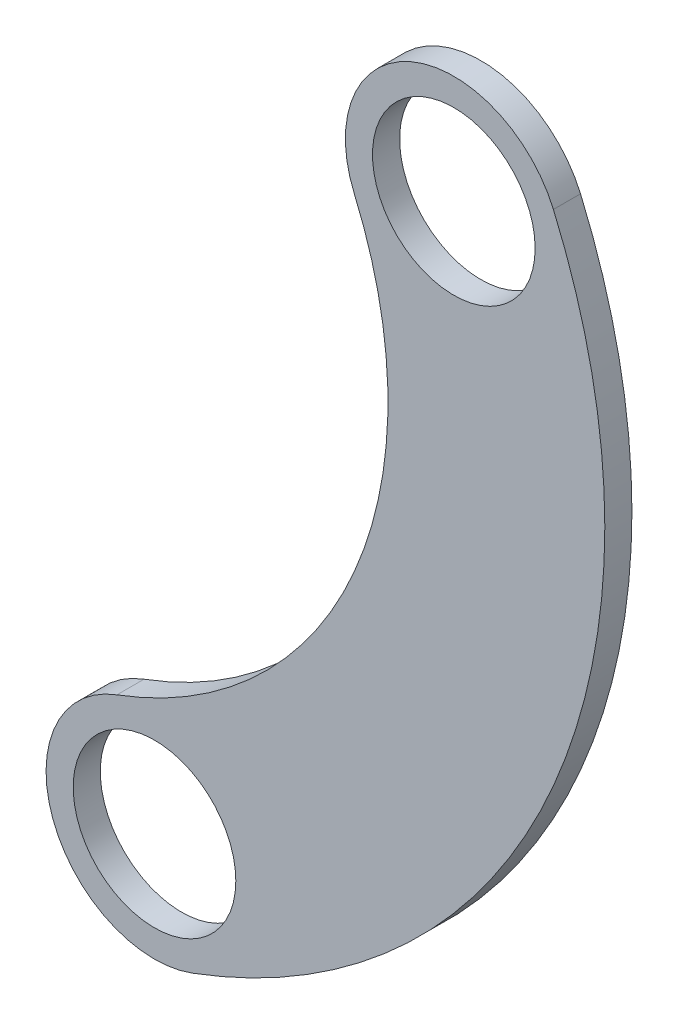
ISO-10303-21;
HEADER;
FILE_DESCRIPTION(('STEP AP214'),'2;1');
FILE_NAME('part.step','',(''),(''),'','','');
FILE_SCHEMA(('AUTOMOTIVE_DESIGN { 1 0 10303 214 1 1 1 1 }'));
ENDSEC;
DATA;
#1=APPLICATION_CONTEXT('core data for automotive mechanical design processes');
#2=APPLICATION_PROTOCOL_DEFINITION('international standard','automotive_design',2000,#1);
#3=PRODUCT_CONTEXT('',#1,'mechanical');
#4=PRODUCT('Part','Part','',(#3));
#5=PRODUCT_RELATED_PRODUCT_CATEGORY('part','',(#4));
#6=PRODUCT_DEFINITION_FORMATION('','',#4);
#7=PRODUCT_DEFINITION_CONTEXT('part definition',#1,'design');
#8=PRODUCT_DEFINITION('design','',#6,#7);
#9=PRODUCT_DEFINITION_SHAPE('','',#8);
#10=(LENGTH_UNIT() NAMED_UNIT(*) SI_UNIT(.MILLI.,.METRE.));
#11=(NAMED_UNIT(*) PLANE_ANGLE_UNIT() SI_UNIT($,.RADIAN.));
#12=(NAMED_UNIT(*) SI_UNIT($,.STERADIAN.) SOLID_ANGLE_UNIT());
#13=UNCERTAINTY_MEASURE_WITH_UNIT(LENGTH_MEASURE(1.E-05),#10,'distance_accuracy_value','');
#14=(GEOMETRIC_REPRESENTATION_CONTEXT(3) GLOBAL_UNCERTAINTY_ASSIGNED_CONTEXT((#13)) GLOBAL_UNIT_ASSIGNED_CONTEXT((#10,
#11,#12)) REPRESENTATION_CONTEXT('',''));
#15=CARTESIAN_POINT('',(0.,0.,0.));
#16=DIRECTION('',(0.,0.,1.));
#17=DIRECTION('',(1.,0.,0.));
#18=AXIS2_PLACEMENT_3D('',#15,#16,#17);
#19=CARTESIAN_POINT('',(45.3734302000239,-21.9712580384994,1.));
#20=DIRECTION('',(0.,0.,1.));
#21=DIRECTION('',(1.,0.,0.));
#22=AXIS2_PLACEMENT_3D('',#19,#20,#21);
#23=PLANE('',#22);
#24=CARTESIAN_POINT('',(59.759146952505,-5.29271932800727,1.));
#25=DIRECTION('',(0.,0.,1.));
#26=DIRECTION('',(1.,0.,0.));
#27=AXIS2_PLACEMENT_3D('',#24,#25,#26);
#28=CIRCLE('',#27,2.99999999999999);
#29=CARTESIAN_POINT('',(62.7591469525049,-5.29271932800727,1.));
#30=VERTEX_POINT('',#29);
#31=EDGE_CURVE('E106',#30,#30,#28,.T.);
#32=ORIENTED_EDGE('',*,*,#31,.F.);
#33=EDGE_LOOP('',(#32));
#34=FACE_BOUND('',#33,.T.);
#35=CARTESIAN_POINT('',(48.7170476866022,-31.0234799813955,1.));
#36=DIRECTION('',(0.,0.,1.));
#37=DIRECTION('',(1.,0.,0.));
#38=AXIS2_PLACEMENT_3D('',#35,#36,#37);
#39=CIRCLE('',#38,4.00000000000001);
#40=CARTESIAN_POINT('',(47.3310922517511,-27.2712636320085,1.));
#41=VERTEX_POINT('',#40);
#42=CARTESIAN_POINT('',(50.1030031214533,-34.7756963307824,1.));
#43=VERTEX_POINT('',#42);
#44=EDGE_CURVE('E91',#41,#43,#39,.T.);
#45=ORIENTED_EDGE('',*,*,#44,.T.);
#46=CARTESIAN_POINT('',(42.0298127134456,-12.9190360956034,1.));
#47=DIRECTION('',(0.,0.,1.));
#48=DIRECTION('',(1.,0.,0.));
#49=AXIS2_PLACEMENT_3D('',#46,#47,#48);
#50=CIRCLE('',#49,23.3);
#51=CARTESIAN_POINT('',(63.4336203699266,-3.71213554197696,1.));
#52=VERTEX_POINT('',#51);
#53=EDGE_CURVE('E86',#43,#52,#50,.T.);
#54=ORIENTED_EDGE('',*,*,#53,.T.);
#55=CARTESIAN_POINT('',(59.759146952505,-5.29271932800727,1.));
#56=DIRECTION('',(0.,0.,1.));
#57=DIRECTION('',(1.,0.,0.));
#58=AXIS2_PLACEMENT_3D('',#55,#56,#57);
#59=CIRCLE('',#58,4.);
#60=CARTESIAN_POINT('',(56.0846735350833,-6.87330311403756,1.));
#61=VERTEX_POINT('',#60);
#62=EDGE_CURVE('E89',#52,#61,#59,.T.);
#63=ORIENTED_EDGE('',*,*,#62,.T.);
#64=CARTESIAN_POINT('',(42.0298127134456,-12.9190360956034,1.));
#65=DIRECTION('',(0.,0.,-1.));
#66=DIRECTION('',(1.,0.,0.));
#67=AXIS2_PLACEMENT_3D('',#64,#65,#66);
#68=CIRCLE('',#67,15.3);
#69=EDGE_CURVE('E56',#61,#41,#68,.T.);
#70=ORIENTED_EDGE('',*,*,#69,.T.);
#71=EDGE_LOOP('',(#45,#54,#63,#70));
#72=FACE_BOUND('',#71,.T.);
#73=CARTESIAN_POINT('',(48.7170476866022,-31.0234799813955,1.));
#74=DIRECTION('',(0.,0.,1.));
#75=DIRECTION('',(1.,0.,0.));
#76=AXIS2_PLACEMENT_3D('',#73,#74,#75);
#77=CIRCLE('',#76,3.00000000000001);
#78=CARTESIAN_POINT('',(51.7170476866022,-31.0234799813955,1.));
#79=VERTEX_POINT('',#78);
#80=EDGE_CURVE('E121',#79,#79,#77,.T.);
#81=ORIENTED_EDGE('',*,*,#80,.F.);
#82=EDGE_LOOP('',(#81));
#83=FACE_BOUND('',#82,.T.);
#84=ADVANCED_FACE('F39',(#34,#72,#83),#23,.T.);
#85=CARTESIAN_POINT('',(45.3734302000239,-21.9712580384994,0.));
#86=DIRECTION('',(0.,0.,1.));
#87=DIRECTION('',(1.,0.,0.));
#88=AXIS2_PLACEMENT_3D('',#85,#86,#87);
#89=PLANE('',#88);
#90=CARTESIAN_POINT('',(48.7170476866022,-31.0234799813955,0.));
#91=DIRECTION('',(0.,0.,1.));
#92=DIRECTION('',(1.,0.,0.));
#93=AXIS2_PLACEMENT_3D('',#90,#91,#92);
#94=CIRCLE('',#93,4.00000000000001);
#95=CARTESIAN_POINT('',(47.3310922517511,-27.2712636320085,0.));
#96=VERTEX_POINT('',#95);
#97=CARTESIAN_POINT('',(50.1030031214533,-34.7756963307824,0.));
#98=VERTEX_POINT('',#97);
#99=EDGE_CURVE('E103',#96,#98,#94,.T.);
#100=ORIENTED_EDGE('',*,*,#99,.F.);
#101=CARTESIAN_POINT('',(42.0298127134456,-12.9190360956034,0.));
#102=DIRECTION('',(0.,0.,-1.));
#103=DIRECTION('',(1.,0.,0.));
#104=AXIS2_PLACEMENT_3D('',#101,#102,#103);
#105=CIRCLE('',#104,15.3);
#106=CARTESIAN_POINT('',(56.0846735350833,-6.87330311403756,0.));
#107=VERTEX_POINT('',#106);
#108=EDGE_CURVE('E79',#107,#96,#105,.T.);
#109=ORIENTED_EDGE('',*,*,#108,.F.);
#110=CARTESIAN_POINT('',(59.759146952505,-5.29271932800727,0.));
#111=DIRECTION('',(0.,0.,1.));
#112=DIRECTION('',(1.,0.,0.));
#113=AXIS2_PLACEMENT_3D('',#110,#111,#112);
#114=CIRCLE('',#113,4.);
#115=CARTESIAN_POINT('',(63.4336203699266,-3.71213554197696,0.));
#116=VERTEX_POINT('',#115);
#117=EDGE_CURVE('E73',#116,#107,#114,.T.);
#118=ORIENTED_EDGE('',*,*,#117,.F.);
#119=CARTESIAN_POINT('',(42.0298127134456,-12.9190360956034,0.));
#120=DIRECTION('',(0.,0.,1.));
#121=DIRECTION('',(1.,0.,0.));
#122=AXIS2_PLACEMENT_3D('',#119,#120,#121);
#123=CIRCLE('',#122,23.3);
#124=EDGE_CURVE('E95',#98,#116,#123,.T.);
#125=ORIENTED_EDGE('',*,*,#124,.F.);
#126=EDGE_LOOP('',(#100,#109,#118,#125));
#127=FACE_BOUND('',#126,.T.);
#128=CARTESIAN_POINT('',(59.759146952505,-5.29271932800727,0.));
#129=DIRECTION('',(0.,0.,1.));
#130=DIRECTION('',(1.,0.,0.));
#131=AXIS2_PLACEMENT_3D('',#128,#129,#130);
#132=CIRCLE('',#131,2.99999999999999);
#133=CARTESIAN_POINT('',(62.7591469525049,-5.29271932800727,0.));
#134=VERTEX_POINT('',#133);
#135=EDGE_CURVE('E118',#134,#134,#132,.T.);
#136=ORIENTED_EDGE('',*,*,#135,.T.);
#137=EDGE_LOOP('',(#136));
#138=FACE_BOUND('',#137,.T.);
#139=CARTESIAN_POINT('',(48.7170476866022,-31.0234799813955,0.));
#140=DIRECTION('',(0.,0.,1.));
#141=DIRECTION('',(1.,0.,0.));
#142=AXIS2_PLACEMENT_3D('',#139,#140,#141);
#143=CIRCLE('',#142,3.00000000000001);
#144=CARTESIAN_POINT('',(51.7170476866022,-31.0234799813955,0.));
#145=VERTEX_POINT('',#144);
#146=EDGE_CURVE('E124',#145,#145,#143,.T.);
#147=ORIENTED_EDGE('',*,*,#146,.T.);
#148=EDGE_LOOP('',(#147));
#149=FACE_BOUND('',#148,.T.);
#150=ADVANCED_FACE('F114',(#127,#138,#149),#89,.F.);
#151=CARTESIAN_POINT('',(48.7170476866022,-31.0234799813955,1.));
#152=DIRECTION('',(0.,0.,-1.));
#153=DIRECTION('',(-1.,0.,0.));
#154=AXIS2_PLACEMENT_3D('',#151,#152,#153);
#155=CYLINDRICAL_SURFACE('',#154,4.00000000000001);
#156=ORIENTED_EDGE('',*,*,#99,.T.);
#157=DIRECTION('',(0.,0.,-1.));
#158=VECTOR('',#157,1.);
#159=CARTESIAN_POINT('',(50.1030031214533,-34.7756963307824,1.));
#160=LINE('',#159,#158);
#161=EDGE_CURVE('E11',#43,#98,#160,.T.);
#162=ORIENTED_EDGE('',*,*,#161,.F.);
#163=ORIENTED_EDGE('',*,*,#44,.F.);
#164=DIRECTION('',(0.,0.,-1.));
#165=VECTOR('',#164,1.);
#166=CARTESIAN_POINT('',(47.3310922517511,-27.2712636320085,1.));
#167=LINE('',#166,#165);
#168=EDGE_CURVE('E99',#41,#96,#167,.T.);
#169=ORIENTED_EDGE('',*,*,#168,.T.);
#170=EDGE_LOOP('',(#156,#162,#163,#169));
#171=FACE_BOUND('',#170,.T.);
#172=ADVANCED_FACE('F41',(#171),#155,.T.);
#173=CARTESIAN_POINT('',(42.0298127134456,-12.9190360956034,1.));
#174=DIRECTION('',(0.,0.,-1.));
#175=DIRECTION('',(-1.,0.,0.));
#176=AXIS2_PLACEMENT_3D('',#173,#174,#175);
#177=CYLINDRICAL_SURFACE('',#176,23.3);
#178=ORIENTED_EDGE('',*,*,#124,.T.);
#179=DIRECTION('',(0.,0.,-1.));
#180=VECTOR('',#179,1.);
#181=CARTESIAN_POINT('',(63.4336203699266,-3.71213554197696,1.));
#182=LINE('',#181,#180);
#183=EDGE_CURVE('E48',#52,#116,#182,.T.);
#184=ORIENTED_EDGE('',*,*,#183,.F.);
#185=ORIENTED_EDGE('',*,*,#53,.F.);
#186=ORIENTED_EDGE('',*,*,#161,.T.);
#187=EDGE_LOOP('',(#178,#184,#185,#186));
#188=FACE_BOUND('',#187,.T.);
#189=ADVANCED_FACE('F94',(#188),#177,.T.);
#190=CARTESIAN_POINT('',(59.759146952505,-5.29271932800727,1.));
#191=DIRECTION('',(0.,0.,-1.));
#192=DIRECTION('',(-1.,0.,0.));
#193=AXIS2_PLACEMENT_3D('',#190,#191,#192);
#194=CYLINDRICAL_SURFACE('',#193,4.);
#195=ORIENTED_EDGE('',*,*,#117,.T.);
#196=DIRECTION('',(0.,0.,-1.));
#197=VECTOR('',#196,1.);
#198=CARTESIAN_POINT('',(56.0846735350833,-6.87330311403756,1.));
#199=LINE('',#198,#197);
#200=EDGE_CURVE('E96',#61,#107,#199,.T.);
#201=ORIENTED_EDGE('',*,*,#200,.F.);
#202=ORIENTED_EDGE('',*,*,#62,.F.);
#203=ORIENTED_EDGE('',*,*,#183,.T.);
#204=EDGE_LOOP('',(#195,#201,#202,#203));
#205=FACE_BOUND('',#204,.T.);
#206=ADVANCED_FACE('F97',(#205),#194,.T.);
#207=CARTESIAN_POINT('',(42.0298127134456,-12.9190360956034,1.));
#208=DIRECTION('',(0.,0.,-1.));
#209=DIRECTION('',(-1.,0.,0.));
#210=AXIS2_PLACEMENT_3D('',#207,#208,#209);
#211=CYLINDRICAL_SURFACE('',#210,15.3);
#212=ORIENTED_EDGE('',*,*,#108,.T.);
#213=ORIENTED_EDGE('',*,*,#168,.F.);
#214=ORIENTED_EDGE('',*,*,#69,.F.);
#215=ORIENTED_EDGE('',*,*,#200,.T.);
#216=EDGE_LOOP('',(#212,#213,#214,#215));
#217=FACE_BOUND('',#216,.T.);
#218=ADVANCED_FACE('F111',(#217),#211,.F.);
#219=CARTESIAN_POINT('',(59.759146952505,-5.29271932800727,1.));
#220=DIRECTION('',(0.,0.,-1.));
#221=DIRECTION('',(-1.,0.,0.));
#222=AXIS2_PLACEMENT_3D('',#219,#220,#221);
#223=CYLINDRICAL_SURFACE('',#222,2.99999999999999);
#224=ORIENTED_EDGE('',*,*,#31,.T.);
#225=EDGE_LOOP('',(#224));
#226=FACE_BOUND('',#225,.T.);
#227=ORIENTED_EDGE('',*,*,#135,.F.);
#228=EDGE_LOOP('',(#227));
#229=FACE_BOUND('',#228,.T.);
#230=ADVANCED_FACE('F141',(#226,#229),#223,.F.);
#231=CARTESIAN_POINT('',(48.7170476866022,-31.0234799813955,1.));
#232=DIRECTION('',(0.,0.,-1.));
#233=DIRECTION('',(-1.,0.,0.));
#234=AXIS2_PLACEMENT_3D('',#231,#232,#233);
#235=CYLINDRICAL_SURFACE('',#234,3.00000000000001);
#236=ORIENTED_EDGE('',*,*,#80,.T.);
#237=EDGE_LOOP('',(#236));
#238=FACE_BOUND('',#237,.T.);
#239=ORIENTED_EDGE('',*,*,#146,.F.);
#240=EDGE_LOOP('',(#239));
#241=FACE_BOUND('',#240,.T.);
#242=ADVANCED_FACE('F130',(#238,#241),#235,.F.);
#243=CLOSED_SHELL('',(#84,#150,#172,#189,#206,#218,#230,#242));
#244=MANIFOLD_SOLID_BREP('B2',#243);
#245=ADVANCED_BREP_SHAPE_REPRESENTATION('',(#18,#244),#14);
#246=SHAPE_DEFINITION_REPRESENTATION(#9,#245);
ENDSEC;
END-ISO-10303-21;
